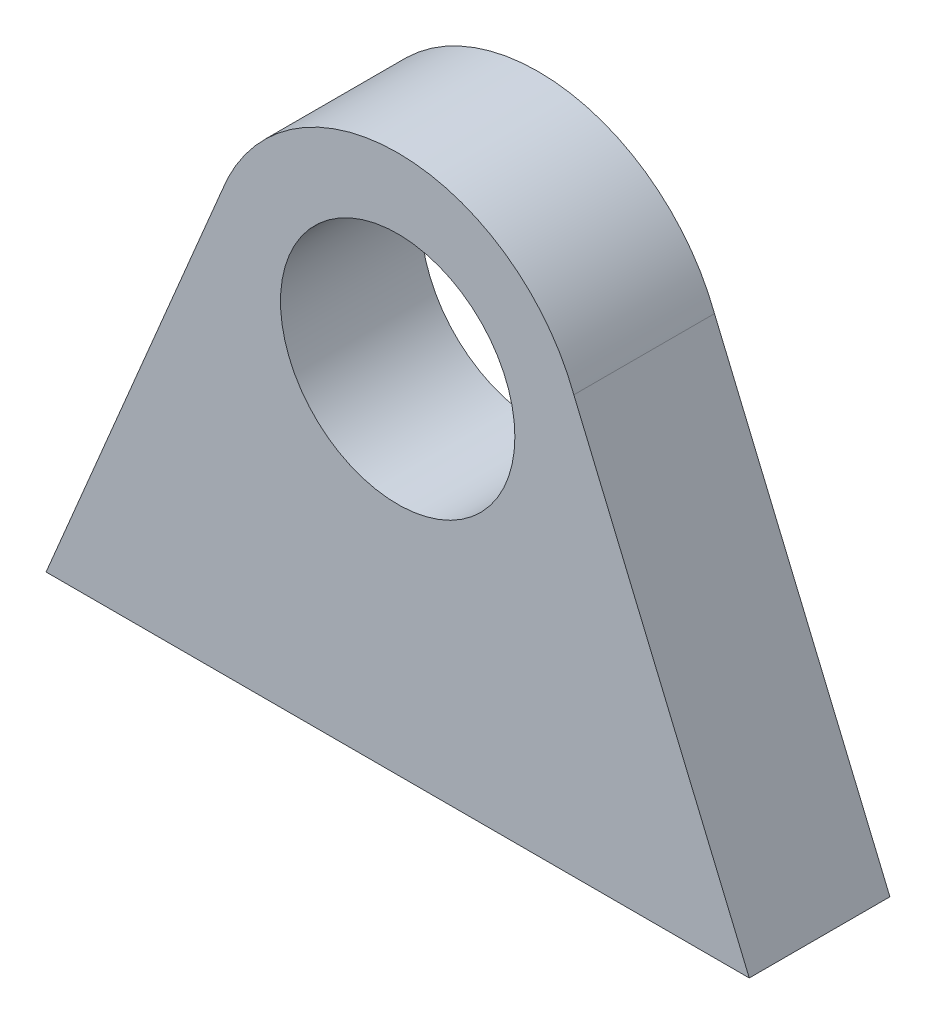
ISO-10303-21;
HEADER;
FILE_DESCRIPTION(('STEP AP214'),'2;1');
FILE_NAME('part.step','',(''),(''),'','','');
FILE_SCHEMA(('AUTOMOTIVE_DESIGN { 1 0 10303 214 1 1 1 1 }'));
ENDSEC;
DATA;
#1=APPLICATION_CONTEXT('core data for automotive mechanical design processes');
#2=APPLICATION_PROTOCOL_DEFINITION('international standard','automotive_design',2000,#1);
#3=PRODUCT_CONTEXT('',#1,'mechanical');
#4=PRODUCT('Part','Part','',(#3));
#5=PRODUCT_RELATED_PRODUCT_CATEGORY('part','',(#4));
#6=PRODUCT_DEFINITION_FORMATION('','',#4);
#7=PRODUCT_DEFINITION_CONTEXT('part definition',#1,'design');
#8=PRODUCT_DEFINITION('design','',#6,#7);
#9=PRODUCT_DEFINITION_SHAPE('','',#8);
#10=(LENGTH_UNIT() NAMED_UNIT(*) SI_UNIT(.MILLI.,.METRE.));
#11=(NAMED_UNIT(*) PLANE_ANGLE_UNIT() SI_UNIT($,.RADIAN.));
#12=(NAMED_UNIT(*) SI_UNIT($,.STERADIAN.) SOLID_ANGLE_UNIT());
#13=UNCERTAINTY_MEASURE_WITH_UNIT(LENGTH_MEASURE(1.E-05),#10,'distance_accuracy_value','');
#14=(GEOMETRIC_REPRESENTATION_CONTEXT(3) GLOBAL_UNCERTAINTY_ASSIGNED_CONTEXT((#13)) GLOBAL_UNIT_ASSIGNED_CONTEXT((#10,
#11,#12)) REPRESENTATION_CONTEXT('',''));
#15=CARTESIAN_POINT('',(0.,0.,0.));
#16=DIRECTION('',(0.,0.,1.));
#17=DIRECTION('',(1.,0.,0.));
#18=AXIS2_PLACEMENT_3D('',#15,#16,#17);
#19=CARTESIAN_POINT('',(75.0008369905232,74.7626089056059,29.9999999999996));
#20=DIRECTION('',(0.,0.,-1.));
#21=DIRECTION('',(-1.00000000000001,0.,0.));
#22=AXIS2_PLACEMENT_3D('',#19,#20,#21);
#23=PLANE('',#22);
#24=DIRECTION('',(1.00000000000001,0.,0.));
#25=VECTOR('',#24,1.);
#26=CARTESIAN_POINT('',(0.,0.,30.));
#27=LINE('',#26,#25);
#28=CARTESIAN_POINT('',(0.,0.,30.));
#29=VERTEX_POINT('',#28);
#30=CARTESIAN_POINT('',(150.000000000001,-2.22044604925031E-13,30.));
#31=VERTEX_POINT('',#30);
#32=EDGE_CURVE('E103',#29,#31,#27,.T.);
#33=ORIENTED_EDGE('',*,*,#32,.T.);
#34=DIRECTION('',(-0.387515586452113,0.921863151588504,0.));
#35=VECTOR('',#34,1.);
#36=CARTESIAN_POINT('',(150.000000000001,-2.22044604925031E-13,30.));
#37=LINE('',#36,#35);
#38=CARTESIAN_POINT('',(112.577190444082,89.0253459850944,29.9999999999996));
#39=VERTEX_POINT('',#38);
#40=EDGE_CURVE('E88',#31,#39,#37,.T.);
#41=ORIENTED_EDGE('',*,*,#40,.T.);
#42=CARTESIAN_POINT('',(75.0008369905232,74.7626089056059,29.9999999999996));
#43=DIRECTION('',(0.,0.,1.));
#44=DIRECTION('',(-1.00000000000001,0.,0.));
#45=AXIS2_PLACEMENT_3D('',#42,#43,#44);
#46=CIRCLE('',#45,40.19213863264);
#47=CARTESIAN_POINT('',(37.4403315428502,89.0670291448434,29.9999999999996));
#48=VERTEX_POINT('',#47);
#49=EDGE_CURVE('E54',#39,#48,#46,.T.);
#50=ORIENTED_EDGE('',*,*,#49,.T.);
#51=DIRECTION('',(-0.387515586452106,-0.921863151588506,0.));
#52=VECTOR('',#51,1.);
#53=CARTESIAN_POINT('',(0.,0.,30.));
#54=LINE('',#53,#52);
#55=EDGE_CURVE('E49',#48,#29,#54,.T.);
#56=ORIENTED_EDGE('',*,*,#55,.T.);
#57=EDGE_LOOP('',(#33,#41,#50,#56));
#58=FACE_BOUND('',#57,.T.);
#59=CARTESIAN_POINT('',(75.0000000000005,75.,29.9999999999996));
#60=DIRECTION('',(0.,0.,1.));
#61=DIRECTION('',(1.00000000000001,0.,0.));
#62=AXIS2_PLACEMENT_3D('',#59,#60,#61);
#63=CIRCLE('',#62,25.);
#64=CARTESIAN_POINT('',(100.000000000001,75.,29.9999999999996));
#65=VERTEX_POINT('',#64);
#66=EDGE_CURVE('E93',#65,#65,#63,.T.);
#67=ORIENTED_EDGE('',*,*,#66,.F.);
#68=EDGE_LOOP('',(#67));
#69=FACE_BOUND('',#68,.T.);
#70=ADVANCED_FACE('F34',(#58,#69),#23,.F.);
#71=CARTESIAN_POINT('',(75.0008369905237,74.762608905606,-2.22044604925031E-13));
#72=DIRECTION('',(0.,0.,-1.));
#73=DIRECTION('',(-1.00000000000001,0.,0.));
#74=AXIS2_PLACEMENT_3D('',#71,#72,#73);
#75=PLANE('',#74);
#76=DIRECTION('',(1.00000000000001,0.,0.));
#77=VECTOR('',#76,1.);
#78=CARTESIAN_POINT('',(0.,0.,0.));
#79=LINE('',#78,#77);
#80=CARTESIAN_POINT('',(0.,0.,0.));
#81=VERTEX_POINT('',#80);
#82=CARTESIAN_POINT('',(150.000000000001,-2.22044604925031E-13,0.));
#83=VERTEX_POINT('',#82);
#84=EDGE_CURVE('E80',#81,#83,#79,.T.);
#85=ORIENTED_EDGE('',*,*,#84,.F.);
#86=DIRECTION('',(-0.387515586452106,-0.921863151588506,0.));
#87=VECTOR('',#86,1.);
#88=CARTESIAN_POINT('',(0.,0.,0.));
#89=LINE('',#88,#87);
#90=CARTESIAN_POINT('',(37.4403315428502,89.0670291448434,-4.44089209850063E-13));
#91=VERTEX_POINT('',#90);
#92=EDGE_CURVE('E101',#91,#81,#89,.T.);
#93=ORIENTED_EDGE('',*,*,#92,.F.);
#94=CARTESIAN_POINT('',(75.0008369905237,74.762608905606,-2.22044604925031E-13));
#95=DIRECTION('',(0.,0.,1.));
#96=DIRECTION('',(-1.00000000000001,0.,0.));
#97=AXIS2_PLACEMENT_3D('',#94,#95,#96);
#98=CIRCLE('',#97,40.19213863264);
#99=CARTESIAN_POINT('',(112.577190444083,89.0253459850939,-2.22044604925031E-13));
#100=VERTEX_POINT('',#99);
#101=EDGE_CURVE('E81',#100,#91,#98,.T.);
#102=ORIENTED_EDGE('',*,*,#101,.F.);
#103=DIRECTION('',(-0.387515586452113,0.921863151588504,0.));
#104=VECTOR('',#103,1.);
#105=CARTESIAN_POINT('',(150.000000000001,-2.22044604925031E-13,0.));
#106=LINE('',#105,#104);
#107=EDGE_CURVE('E75',#83,#100,#106,.T.);
#108=ORIENTED_EDGE('',*,*,#107,.F.);
#109=EDGE_LOOP('',(#85,#93,#102,#108));
#110=FACE_BOUND('',#109,.T.);
#111=CARTESIAN_POINT('',(75.0000000000006,75.0000000000001,-2.22044604925031E-13));
#112=DIRECTION('',(0.,0.,1.));
#113=DIRECTION('',(1.00000000000001,0.,0.));
#114=AXIS2_PLACEMENT_3D('',#111,#112,#113);
#115=CIRCLE('',#114,25.);
#116=CARTESIAN_POINT('',(100.000000000001,75.0000000000001,-2.22044604925031E-13));
#117=VERTEX_POINT('',#116);
#118=EDGE_CURVE('E96',#117,#117,#115,.T.);
#119=ORIENTED_EDGE('',*,*,#118,.T.);
#120=EDGE_LOOP('',(#119));
#121=FACE_BOUND('',#120,.T.);
#122=ADVANCED_FACE('F76',(#110,#121),#75,.T.);
#123=CARTESIAN_POINT('',(0.,0.,30.));
#124=DIRECTION('',(0.,1.,0.));
#125=DIRECTION('',(0.,0.,1.));
#126=AXIS2_PLACEMENT_3D('',#123,#124,#125);
#127=PLANE('',#126);
#128=ORIENTED_EDGE('',*,*,#84,.T.);
#129=DIRECTION('',(0.,0.,-1.));
#130=VECTOR('',#129,1.);
#131=CARTESIAN_POINT('',(150.000000000001,-2.22044604925031E-13,30.));
#132=LINE('',#131,#130);
#133=EDGE_CURVE('E11',#31,#83,#132,.T.);
#134=ORIENTED_EDGE('',*,*,#133,.F.);
#135=ORIENTED_EDGE('',*,*,#32,.F.);
#136=DIRECTION('',(0.,0.,-1.));
#137=VECTOR('',#136,1.);
#138=CARTESIAN_POINT('',(0.,0.,30.));
#139=LINE('',#138,#137);
#140=EDGE_CURVE('E92',#29,#81,#139,.T.);
#141=ORIENTED_EDGE('',*,*,#140,.T.);
#142=EDGE_LOOP('',(#128,#134,#135,#141));
#143=FACE_BOUND('',#142,.T.);
#144=ADVANCED_FACE('F36',(#143),#127,.F.);
#145=CARTESIAN_POINT('',(150.000000000001,-2.22044604925031E-13,30.));
#146=DIRECTION('',(-0.921863151588511,-0.387515586452109,0.));
#147=DIRECTION('',(0.387515586452113,-0.921863151588504,0.));
#148=AXIS2_PLACEMENT_3D('',#145,#146,#147);
#149=PLANE('',#148);
#150=ORIENTED_EDGE('',*,*,#107,.T.);
#151=DIRECTION('',(0.,0.,-1.));
#152=VECTOR('',#151,1.);
#153=CARTESIAN_POINT('',(112.577190444082,89.0253459850944,29.9999999999996));
#154=LINE('',#153,#152);
#155=EDGE_CURVE('E42',#39,#100,#154,.T.);
#156=ORIENTED_EDGE('',*,*,#155,.F.);
#157=ORIENTED_EDGE('',*,*,#40,.F.);
#158=ORIENTED_EDGE('',*,*,#133,.T.);
#159=EDGE_LOOP('',(#150,#156,#157,#158));
#160=FACE_BOUND('',#159,.T.);
#161=ADVANCED_FACE('F87',(#160),#149,.F.);
#162=CARTESIAN_POINT('',(75.0008369905232,74.7626089056059,29.9999999999996));
#163=DIRECTION('',(0.,0.,-1.));
#164=DIRECTION('',(-1.00000000000001,0.,0.));
#165=AXIS2_PLACEMENT_3D('',#162,#163,#164);
#166=CYLINDRICAL_SURFACE('',#165,40.19213863264);
#167=ORIENTED_EDGE('',*,*,#101,.T.);
#168=DIRECTION('',(0.,0.,-1.));
#169=VECTOR('',#168,1.);
#170=CARTESIAN_POINT('',(37.4403315428502,89.0670291448434,29.9999999999996));
#171=LINE('',#170,#169);
#172=EDGE_CURVE('E109',#48,#91,#171,.T.);
#173=ORIENTED_EDGE('',*,*,#172,.F.);
#174=ORIENTED_EDGE('',*,*,#49,.F.);
#175=ORIENTED_EDGE('',*,*,#155,.T.);
#176=EDGE_LOOP('',(#167,#173,#174,#175));
#177=FACE_BOUND('',#176,.T.);
#178=ADVANCED_FACE('F112',(#177),#166,.T.);
#179=CARTESIAN_POINT('',(0.,0.,30.));
#180=DIRECTION('',(0.921863151588514,-0.387515586452103,0.));
#181=DIRECTION('',(0.387515586452106,0.921863151588506,0.));
#182=AXIS2_PLACEMENT_3D('',#179,#180,#181);
#183=PLANE('',#182);
#184=ORIENTED_EDGE('',*,*,#92,.T.);
#185=ORIENTED_EDGE('',*,*,#140,.F.);
#186=ORIENTED_EDGE('',*,*,#55,.F.);
#187=ORIENTED_EDGE('',*,*,#172,.T.);
#188=EDGE_LOOP('',(#184,#185,#186,#187));
#189=FACE_BOUND('',#188,.T.);
#190=ADVANCED_FACE('F114',(#189),#183,.F.);
#191=CARTESIAN_POINT('',(75.0000000000005,75.,29.9999999999996));
#192=DIRECTION('',(0.,0.,-1.));
#193=DIRECTION('',(-1.00000000000001,0.,0.));
#194=AXIS2_PLACEMENT_3D('',#191,#192,#193);
#195=CYLINDRICAL_SURFACE('',#194,25.);
#196=ORIENTED_EDGE('',*,*,#66,.T.);
#197=EDGE_LOOP('',(#196));
#198=FACE_BOUND('',#197,.T.);
#199=ORIENTED_EDGE('',*,*,#118,.F.);
#200=EDGE_LOOP('',(#199));
#201=FACE_BOUND('',#200,.T.);
#202=ADVANCED_FACE('F120',(#198,#201),#195,.F.);
#203=CLOSED_SHELL('',(#70,#122,#144,#161,#178,#190,#202));
#204=MANIFOLD_SOLID_BREP('B2',#203);
#205=ADVANCED_BREP_SHAPE_REPRESENTATION('',(#18,#204),#14);
#206=SHAPE_DEFINITION_REPRESENTATION(#9,#205);
ENDSEC;
END-ISO-10303-21;
